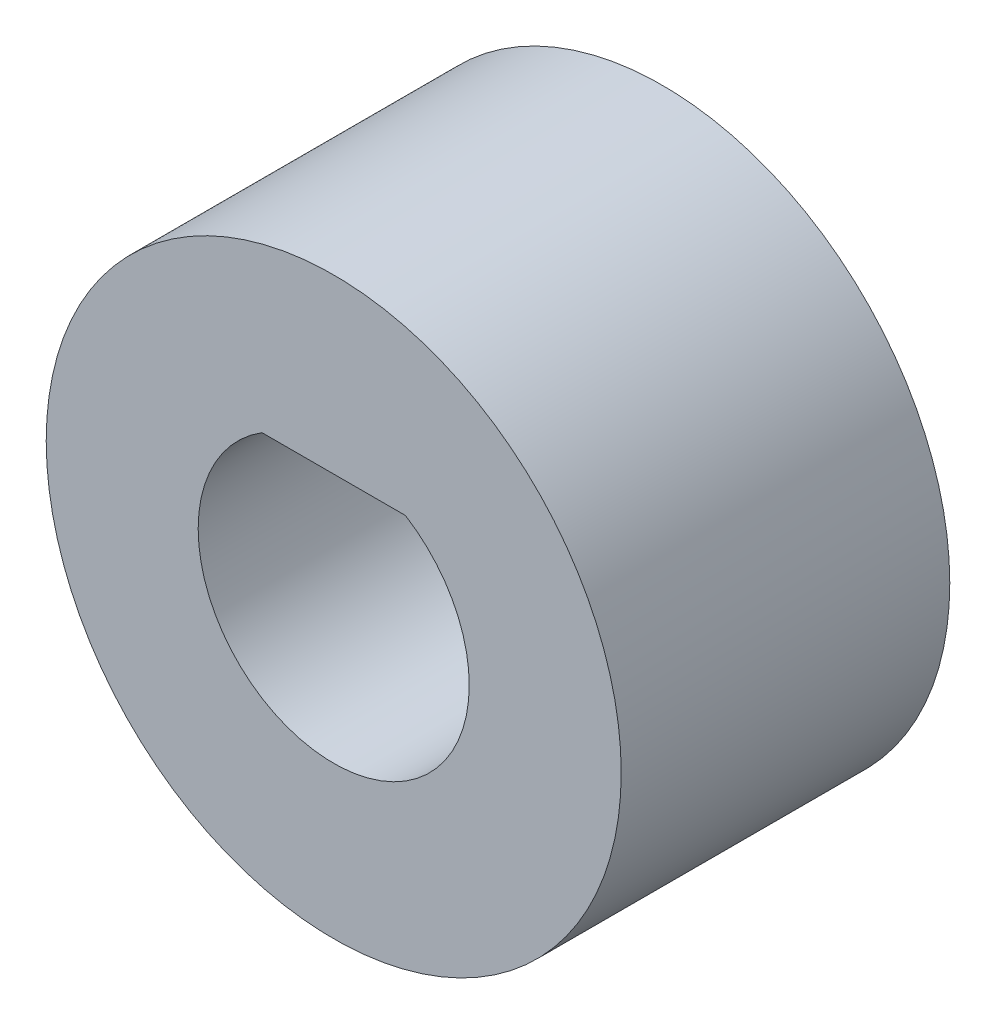
ISO-10303-21;
HEADER;
FILE_DESCRIPTION(('STEP AP214'),'2;1');
FILE_NAME('part.step','',(''),(''),'','','');
FILE_SCHEMA(('AUTOMOTIVE_DESIGN { 1 0 10303 214 1 1 1 1 }'));
ENDSEC;
DATA;
#1=APPLICATION_CONTEXT('core data for automotive mechanical design processes');
#2=APPLICATION_PROTOCOL_DEFINITION('international standard','automotive_design',2000,#1);
#3=PRODUCT_CONTEXT('',#1,'mechanical');
#4=PRODUCT('Part','Part','',(#3));
#5=PRODUCT_RELATED_PRODUCT_CATEGORY('part','',(#4));
#6=PRODUCT_DEFINITION_FORMATION('','',#4);
#7=PRODUCT_DEFINITION_CONTEXT('part definition',#1,'design');
#8=PRODUCT_DEFINITION('design','',#6,#7);
#9=PRODUCT_DEFINITION_SHAPE('','',#8);
#10=(LENGTH_UNIT() NAMED_UNIT(*) SI_UNIT(.MILLI.,.METRE.));
#11=(NAMED_UNIT(*) PLANE_ANGLE_UNIT() SI_UNIT($,.RADIAN.));
#12=(NAMED_UNIT(*) SI_UNIT($,.STERADIAN.) SOLID_ANGLE_UNIT());
#13=UNCERTAINTY_MEASURE_WITH_UNIT(LENGTH_MEASURE(1.E-05),#10,'distance_accuracy_value','');
#14=(GEOMETRIC_REPRESENTATION_CONTEXT(3) GLOBAL_UNCERTAINTY_ASSIGNED_CONTEXT((#13)) GLOBAL_UNIT_ASSIGNED_CONTEXT((#10,
#11,#12)) REPRESENTATION_CONTEXT('',''));
#15=CARTESIAN_POINT('',(0.,0.,0.));
#16=DIRECTION('',(0.,0.,1.));
#17=DIRECTION('',(1.,0.,0.));
#18=AXIS2_PLACEMENT_3D('',#15,#16,#17);
#19=CARTESIAN_POINT('',(0.,0.,8.));
#20=DIRECTION('',(0.,0.,1.));
#21=DIRECTION('',(1.,0.,0.));
#22=AXIS2_PLACEMENT_3D('',#19,#20,#21);
#23=PLANE('',#22);
#24=CARTESIAN_POINT('',(0.,0.,8.));
#25=DIRECTION('',(0.,0.,1.));
#26=DIRECTION('',(1.,0.,0.));
#27=AXIS2_PLACEMENT_3D('',#24,#25,#26);
#28=CIRCLE('',#27,7.);
#29=CARTESIAN_POINT('',(7.,0.,8.));
#30=VERTEX_POINT('',#29);
#31=EDGE_CURVE('E11',#30,#30,#28,.T.);
#32=ORIENTED_EDGE('',*,*,#31,.T.);
#33=EDGE_LOOP('',(#32));
#34=FACE_BOUND('',#33,.T.);
#35=DIRECTION('',(-1.,0.,0.));
#36=VECTOR('',#35,1.);
#37=CARTESIAN_POINT('',(-1.7464249196573,2.8,8.));
#38=LINE('',#37,#36);
#39=CARTESIAN_POINT('',(1.7464249196573,2.8,8.));
#40=VERTEX_POINT('',#39);
#41=CARTESIAN_POINT('',(-1.7464249196573,2.8,8.));
#42=VERTEX_POINT('',#41);
#43=EDGE_CURVE('E84',#40,#42,#38,.T.);
#44=ORIENTED_EDGE('',*,*,#43,.F.);
#45=CARTESIAN_POINT('',(0.,0.,8.));
#46=DIRECTION('',(0.,0.,1.));
#47=DIRECTION('',(1.,0.,0.));
#48=AXIS2_PLACEMENT_3D('',#45,#46,#47);
#49=CIRCLE('',#48,3.3);
#50=EDGE_CURVE('E73',#42,#40,#49,.T.);
#51=ORIENTED_EDGE('',*,*,#50,.F.);
#52=EDGE_LOOP('',(#44,#51));
#53=FACE_BOUND('',#52,.T.);
#54=ADVANCED_FACE('F39',(#34,#53),#23,.T.);
#55=CARTESIAN_POINT('',(0.,0.,0.));
#56=DIRECTION('',(0.,0.,1.));
#57=DIRECTION('',(1.,0.,0.));
#58=AXIS2_PLACEMENT_3D('',#55,#56,#57);
#59=PLANE('',#58);
#60=CARTESIAN_POINT('',(0.,0.,0.));
#61=DIRECTION('',(0.,0.,1.));
#62=DIRECTION('',(1.,0.,0.));
#63=AXIS2_PLACEMENT_3D('',#60,#61,#62);
#64=CIRCLE('',#63,7.);
#65=CARTESIAN_POINT('',(7.,0.,0.));
#66=VERTEX_POINT('',#65);
#67=EDGE_CURVE('E43',#66,#66,#64,.T.);
#68=ORIENTED_EDGE('',*,*,#67,.F.);
#69=EDGE_LOOP('',(#68));
#70=FACE_BOUND('',#69,.T.);
#71=CARTESIAN_POINT('',(0.,0.,0.));
#72=DIRECTION('',(0.,0.,1.));
#73=DIRECTION('',(1.,0.,0.));
#74=AXIS2_PLACEMENT_3D('',#71,#72,#73);
#75=CIRCLE('',#74,3.3);
#76=CARTESIAN_POINT('',(-1.7464249196573,2.8,0.));
#77=VERTEX_POINT('',#76);
#78=CARTESIAN_POINT('',(1.7464249196573,2.8,0.));
#79=VERTEX_POINT('',#78);
#80=EDGE_CURVE('E62',#77,#79,#75,.T.);
#81=ORIENTED_EDGE('',*,*,#80,.T.);
#82=DIRECTION('',(-1.,0.,0.));
#83=VECTOR('',#82,1.);
#84=CARTESIAN_POINT('',(-1.7464249196573,2.8,0.));
#85=LINE('',#84,#83);
#86=EDGE_CURVE('E68',#79,#77,#85,.T.);
#87=ORIENTED_EDGE('',*,*,#86,.T.);
#88=EDGE_LOOP('',(#81,#87));
#89=FACE_BOUND('',#88,.T.);
#90=ADVANCED_FACE('F80',(#70,#89),#59,.F.);
#91=CARTESIAN_POINT('',(0.,0.,8.));
#92=DIRECTION('',(0.,0.,-1.));
#93=DIRECTION('',(-1.,0.,0.));
#94=AXIS2_PLACEMENT_3D('',#91,#92,#93);
#95=CYLINDRICAL_SURFACE('',#94,7.);
#96=ORIENTED_EDGE('',*,*,#31,.F.);
#97=EDGE_LOOP('',(#96));
#98=FACE_BOUND('',#97,.T.);
#99=ORIENTED_EDGE('',*,*,#67,.T.);
#100=EDGE_LOOP('',(#99));
#101=FACE_BOUND('',#100,.T.);
#102=ADVANCED_FACE('F41',(#98,#101),#95,.T.);
#103=CARTESIAN_POINT('',(0.,0.,8.));
#104=DIRECTION('',(0.,0.,-1.));
#105=DIRECTION('',(-1.,0.,0.));
#106=AXIS2_PLACEMENT_3D('',#103,#104,#105);
#107=CYLINDRICAL_SURFACE('',#106,3.3);
#108=ORIENTED_EDGE('',*,*,#80,.F.);
#109=DIRECTION('',(0.,0.,-1.));
#110=VECTOR('',#109,1.);
#111=CARTESIAN_POINT('',(-1.7464249196573,2.8,8.));
#112=LINE('',#111,#110);
#113=EDGE_CURVE('E70',#42,#77,#112,.T.);
#114=ORIENTED_EDGE('',*,*,#113,.F.);
#115=ORIENTED_EDGE('',*,*,#50,.T.);
#116=DIRECTION('',(0.,0.,-1.));
#117=VECTOR('',#116,1.);
#118=CARTESIAN_POINT('',(1.7464249196573,2.8,8.));
#119=LINE('',#118,#117);
#120=EDGE_CURVE('E55',#40,#79,#119,.T.);
#121=ORIENTED_EDGE('',*,*,#120,.T.);
#122=EDGE_LOOP('',(#108,#114,#115,#121));
#123=FACE_BOUND('',#122,.T.);
#124=ADVANCED_FACE('F75',(#123),#107,.F.);
#125=CARTESIAN_POINT('',(-1.7464249196573,2.8,8.));
#126=DIRECTION('',(0.,-1.,0.));
#127=DIRECTION('',(0.,0.,-1.));
#128=AXIS2_PLACEMENT_3D('',#125,#126,#127);
#129=PLANE('',#128);
#130=ORIENTED_EDGE('',*,*,#86,.F.);
#131=ORIENTED_EDGE('',*,*,#120,.F.);
#132=ORIENTED_EDGE('',*,*,#43,.T.);
#133=ORIENTED_EDGE('',*,*,#113,.T.);
#134=EDGE_LOOP('',(#130,#131,#132,#133));
#135=FACE_BOUND('',#134,.T.);
#136=ADVANCED_FACE('F69',(#135),#129,.T.);
#137=CLOSED_SHELL('',(#54,#90,#102,#124,#136));
#138=MANIFOLD_SOLID_BREP('B2',#137);
#139=ADVANCED_BREP_SHAPE_REPRESENTATION('',(#18,#138),#14);
#140=SHAPE_DEFINITION_REPRESENTATION(#9,#139);
ENDSEC;
END-ISO-10303-21;
